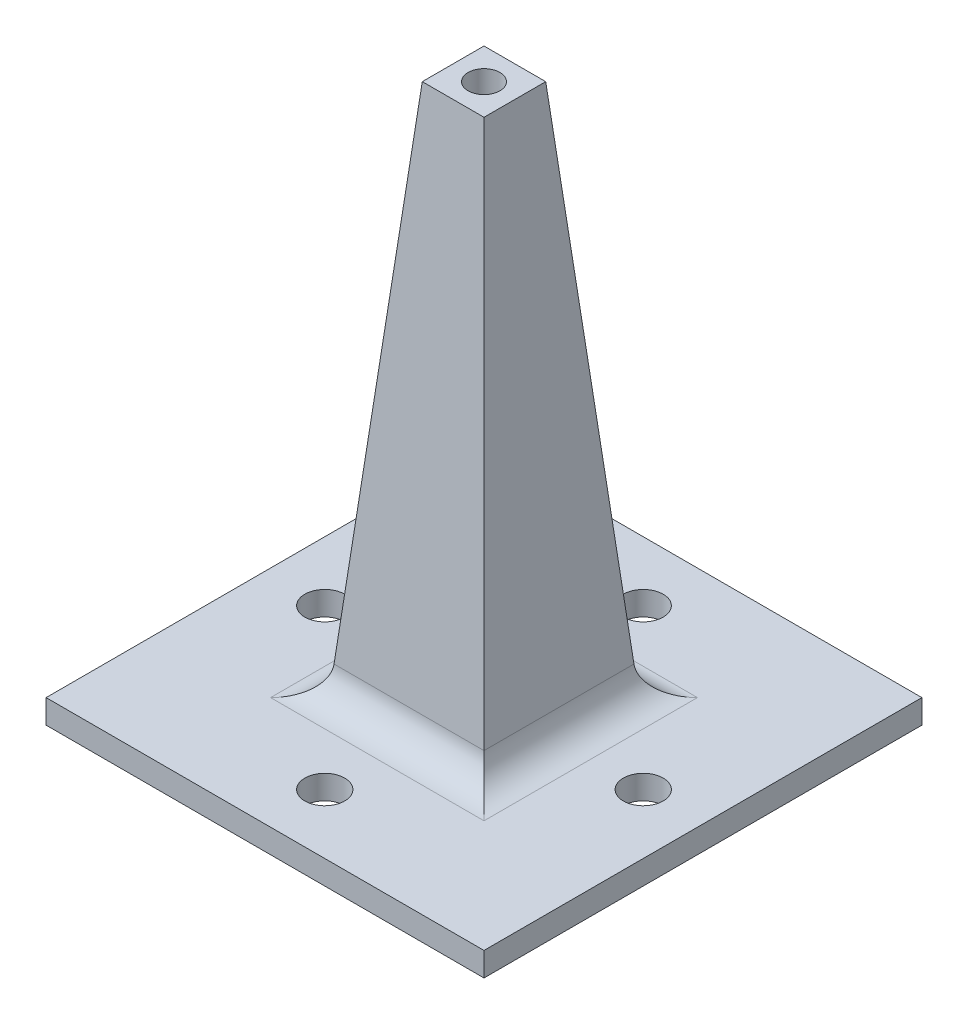
ISO-10303-21;
HEADER;
FILE_DESCRIPTION(('STEP AP214'),'2;1');
FILE_NAME('part.step','',(''),(''),'','','');
FILE_SCHEMA(('AUTOMOTIVE_DESIGN { 1 0 10303 214 1 1 1 1 }'));
ENDSEC;
DATA;
#1=APPLICATION_CONTEXT('core data for automotive mechanical design processes');
#2=APPLICATION_PROTOCOL_DEFINITION('international standard','automotive_design',2000,#1);
#3=PRODUCT_CONTEXT('',#1,'mechanical');
#4=PRODUCT('Part','Part','',(#3));
#5=PRODUCT_RELATED_PRODUCT_CATEGORY('part','',(#4));
#6=PRODUCT_DEFINITION_FORMATION('','',#4);
#7=PRODUCT_DEFINITION_CONTEXT('part definition',#1,'design');
#8=PRODUCT_DEFINITION('design','',#6,#7);
#9=PRODUCT_DEFINITION_SHAPE('','',#8);
#10=(LENGTH_UNIT() NAMED_UNIT(*) SI_UNIT(.MILLI.,.METRE.));
#11=(NAMED_UNIT(*) PLANE_ANGLE_UNIT() SI_UNIT($,.RADIAN.));
#12=(NAMED_UNIT(*) SI_UNIT($,.STERADIAN.) SOLID_ANGLE_UNIT());
#13=UNCERTAINTY_MEASURE_WITH_UNIT(LENGTH_MEASURE(1.E-05),#10,'distance_accuracy_value','');
#14=(GEOMETRIC_REPRESENTATION_CONTEXT(3) GLOBAL_UNCERTAINTY_ASSIGNED_CONTEXT((#13)) GLOBAL_UNIT_ASSIGNED_CONTEXT((#10,
#11,#12)) REPRESENTATION_CONTEXT('',''));
#15=CARTESIAN_POINT('',(0.,0.,0.));
#16=DIRECTION('',(0.,0.,1.));
#17=DIRECTION('',(1.,0.,0.));
#18=AXIS2_PLACEMENT_3D('',#15,#16,#17);
#19=CARTESIAN_POINT('',(9.99999999999999,0.,-10.));
#20=DIRECTION('',(0.996194698091746,0.0871557427476582,0.));
#21=DIRECTION('',(-0.0871557427476582,0.996194698091746,0.));
#22=AXIS2_PLACEMENT_3D('',#19,#20,#21);
#23=PLANE('',#22);
#24=DIRECTION('',(0.0868265938642477,-0.992432509138967,0.0868265938642476));
#25=VECTOR('',#24,1.);
#26=CARTESIAN_POINT('',(9.84922285195865,1.72339068817371,9.84922285195866));
#27=LINE('',#26,#25);
#28=CARTESIAN_POINT('',(3.87579355318531,70.,3.87579355318532));
#29=VERTEX_POINT('',#28);
#30=CARTESIAN_POINT('',(9.41807991312493,6.65137702900937,9.41807991312494));
#31=VERTEX_POINT('',#30);
#32=EDGE_CURVE('E171',#29,#31,#27,.T.);
#33=ORIENTED_EDGE('',*,*,#32,.T.);
#34=DIRECTION('',(0.,0.,1.));
#35=VECTOR('',#34,1.);
#36=CARTESIAN_POINT('',(9.41807991312493,6.65137702900937,-9.73753400942223));
#37=LINE('',#36,#35);
#38=CARTESIAN_POINT('',(9.41807991312493,6.65137702900937,-9.41807991312494));
#39=VERTEX_POINT('',#38);
#40=EDGE_CURVE('E43',#31,#39,#37,.F.);
#41=ORIENTED_EDGE('',*,*,#40,.T.);
#42=DIRECTION('',(0.0868265938642476,-0.992432509138967,-0.0868265938642476));
#43=VECTOR('',#42,1.);
#44=CARTESIAN_POINT('',(9.84922285195865,1.72339068817371,-9.84922285195866));
#45=LINE('',#44,#43);
#46=CARTESIAN_POINT('',(3.87579355318531,70.,-3.87579355318532));
#47=VERTEX_POINT('',#46);
#48=EDGE_CURVE('E167',#47,#39,#45,.T.);
#49=ORIENTED_EDGE('',*,*,#48,.F.);
#50=DIRECTION('',(0.,0.,1.));
#51=VECTOR('',#50,1.);
#52=CARTESIAN_POINT('',(3.87579355318531,70.,-10.));
#53=LINE('',#52,#51);
#54=EDGE_CURVE('E164',#29,#47,#53,.F.);
#55=ORIENTED_EDGE('',*,*,#54,.F.);
#56=EDGE_LOOP('',(#33,#41,#49,#55));
#57=FACE_BOUND('',#56,.T.);
#58=ADVANCED_FACE('F34',(#57),#23,.T.);
#59=CARTESIAN_POINT('',(-10.,0.,-10.));
#60=DIRECTION('',(0.,0.0871557427476582,-0.996194698091746));
#61=DIRECTION('',(0.,0.996194698091746,0.0871557427476582));
#62=AXIS2_PLACEMENT_3D('',#59,#60,#61);
#63=PLANE('',#62);
#64=ORIENTED_EDGE('',*,*,#48,.T.);
#65=DIRECTION('',(1.,0.,0.));
#66=VECTOR('',#65,1.);
#67=CARTESIAN_POINT('',(-9.73753400942223,6.65137702900937,-9.41807991312494));
#68=LINE('',#67,#66);
#69=CARTESIAN_POINT('',(-9.41807991312495,6.65137702900937,-9.41807991312494));
#70=VERTEX_POINT('',#69);
#71=EDGE_CURVE('E11',#39,#70,#68,.F.);
#72=ORIENTED_EDGE('',*,*,#71,.T.);
#73=DIRECTION('',(-0.0868265938642477,-0.992432509138967,-0.0868265938642476));
#74=VECTOR('',#73,1.);
#75=CARTESIAN_POINT('',(-10.,0.,-10.));
#76=LINE('',#75,#74);
#77=CARTESIAN_POINT('',(-3.87579355318532,70.,-3.87579355318532));
#78=VERTEX_POINT('',#77);
#79=EDGE_CURVE('E170',#78,#70,#76,.T.);
#80=ORIENTED_EDGE('',*,*,#79,.F.);
#81=DIRECTION('',(1.,0.,0.));
#82=VECTOR('',#81,1.);
#83=CARTESIAN_POINT('',(-10.,70.,-3.87579355318532));
#84=LINE('',#83,#82);
#85=EDGE_CURVE('E180',#47,#78,#84,.F.);
#86=ORIENTED_EDGE('',*,*,#85,.F.);
#87=EDGE_LOOP('',(#64,#72,#80,#86));
#88=FACE_BOUND('',#87,.T.);
#89=ADVANCED_FACE('F235',(#88),#63,.T.);
#90=CARTESIAN_POINT('',(-10.,0.,-10.));
#91=DIRECTION('',(-0.996194698091746,0.0871557427476582,0.));
#92=DIRECTION('',(-0.0871557427476582,-0.996194698091746,0.));
#93=AXIS2_PLACEMENT_3D('',#90,#91,#92);
#94=PLANE('',#93);
#95=ORIENTED_EDGE('',*,*,#79,.T.);
#96=DIRECTION('',(0.,0.,-1.));
#97=VECTOR('',#96,1.);
#98=CARTESIAN_POINT('',(-9.41807991312494,6.65137702900937,9.73753400942223));
#99=LINE('',#98,#97);
#100=CARTESIAN_POINT('',(-9.41807991312494,6.65137702900937,9.41807991312494));
#101=VERTEX_POINT('',#100);
#102=EDGE_CURVE('E193',#70,#101,#99,.F.);
#103=ORIENTED_EDGE('',*,*,#102,.T.);
#104=DIRECTION('',(-0.0868265938642476,-0.992432509138967,0.0868265938642476));
#105=VECTOR('',#104,1.);
#106=CARTESIAN_POINT('',(-10.,0.,10.));
#107=LINE('',#106,#105);
#108=CARTESIAN_POINT('',(-3.87579355318532,70.,3.87579355318532));
#109=VERTEX_POINT('',#108);
#110=EDGE_CURVE('E173',#109,#101,#107,.T.);
#111=ORIENTED_EDGE('',*,*,#110,.F.);
#112=DIRECTION('',(0.,0.,-1.));
#113=VECTOR('',#112,1.);
#114=CARTESIAN_POINT('',(-3.87579355318532,70.,-10.));
#115=LINE('',#114,#113);
#116=EDGE_CURVE('E182',#78,#109,#115,.F.);
#117=ORIENTED_EDGE('',*,*,#116,.F.);
#118=EDGE_LOOP('',(#95,#103,#111,#117));
#119=FACE_BOUND('',#118,.T.);
#120=ADVANCED_FACE('F240',(#119),#94,.T.);
#121=CARTESIAN_POINT('',(-10.,0.,10.));
#122=DIRECTION('',(0.,0.0871557427476582,0.996194698091746));
#123=DIRECTION('',(0.,-0.996194698091746,0.0871557427476582));
#124=AXIS2_PLACEMENT_3D('',#121,#122,#123);
#125=PLANE('',#124);
#126=ORIENTED_EDGE('',*,*,#110,.T.);
#127=DIRECTION('',(-1.,0.,0.));
#128=VECTOR('',#127,1.);
#129=CARTESIAN_POINT('',(9.73753400942222,6.65137702900937,9.41807991312494));
#130=LINE('',#129,#128);
#131=EDGE_CURVE('E58',#101,#31,#130,.F.);
#132=ORIENTED_EDGE('',*,*,#131,.T.);
#133=ORIENTED_EDGE('',*,*,#32,.F.);
#134=DIRECTION('',(-1.,0.,0.));
#135=VECTOR('',#134,1.);
#136=CARTESIAN_POINT('',(-10.,70.,3.87579355318532));
#137=LINE('',#136,#135);
#138=EDGE_CURVE('E174',#109,#29,#137,.F.);
#139=ORIENTED_EDGE('',*,*,#138,.F.);
#140=EDGE_LOOP('',(#126,#132,#133,#139));
#141=FACE_BOUND('',#140,.T.);
#142=ADVANCED_FACE('F246',(#141),#125,.T.);
#143=CARTESIAN_POINT('',(0.,70.,0.));
#144=DIRECTION('',(0.,1.,0.));
#145=DIRECTION('',(0.,0.,1.));
#146=AXIS2_PLACEMENT_3D('',#143,#144,#145);
#147=PLANE('',#146);
#148=CARTESIAN_POINT('',(0.,70.,0.));
#149=DIRECTION('',(0.,1.,0.));
#150=DIRECTION('',(0.,0.,1.));
#151=AXIS2_PLACEMENT_3D('',#148,#149,#150);
#152=CIRCLE('',#151,2.);
#153=CARTESIAN_POINT('',(0.,70.,2.));
#154=VERTEX_POINT('',#153);
#155=EDGE_CURVE('E157',#154,#154,#152,.T.);
#156=ORIENTED_EDGE('',*,*,#155,.F.);
#157=EDGE_LOOP('',(#156));
#158=FACE_BOUND('',#157,.T.);
#159=ORIENTED_EDGE('',*,*,#54,.T.);
#160=ORIENTED_EDGE('',*,*,#85,.T.);
#161=ORIENTED_EDGE('',*,*,#116,.T.);
#162=ORIENTED_EDGE('',*,*,#138,.T.);
#163=EDGE_LOOP('',(#159,#160,#161,#162));
#164=FACE_BOUND('',#163,.T.);
#165=ADVANCED_FACE('F249',(#158,#164),#147,.T.);
#166=CARTESIAN_POINT('',(0.,57.5,0.));
#167=DIRECTION('',(0.,1.,0.));
#168=DIRECTION('',(0.,0.,1.));
#169=AXIS2_PLACEMENT_3D('',#166,#167,#168);
#170=CYLINDRICAL_SURFACE('',#169,2.);
#171=CARTESIAN_POINT('',(0.,57.5,0.));
#172=DIRECTION('',(0.,1.,0.));
#173=DIRECTION('',(0.,0.,1.));
#174=AXIS2_PLACEMENT_3D('',#171,#172,#173);
#175=CIRCLE('',#174,2.);
#176=CARTESIAN_POINT('',(0.,57.5,2.));
#177=VERTEX_POINT('',#176);
#178=EDGE_CURVE('E161',#177,#177,#175,.T.);
#179=ORIENTED_EDGE('',*,*,#178,.F.);
#180=EDGE_LOOP('',(#179));
#181=FACE_BOUND('',#180,.T.);
#182=ORIENTED_EDGE('',*,*,#155,.T.);
#183=EDGE_LOOP('',(#182));
#184=FACE_BOUND('',#183,.T.);
#185=ADVANCED_FACE('F292',(#181,#184),#170,.F.);
#186=CARTESIAN_POINT('',(0.,57.5,0.));
#187=DIRECTION('',(0.,1.,0.));
#188=DIRECTION('',(0.,0.,1.));
#189=AXIS2_PLACEMENT_3D('',#186,#187,#188);
#190=PLANE('',#189);
#191=ORIENTED_EDGE('',*,*,#178,.T.);
#192=EDGE_LOOP('',(#191));
#193=FACE_BOUND('',#192,.T.);
#194=ADVANCED_FACE('F283',(#193),#190,.T.);
#195=CARTESIAN_POINT('',(0.,3.,0.));
#196=DIRECTION('',(0.,-1.,0.));
#197=DIRECTION('',(0.,0.,-1.));
#198=AXIS2_PLACEMENT_3D('',#195,#196,#197);
#199=PLANE('',#198);
#200=CARTESIAN_POINT('',(-20.,3.,0.));
#201=DIRECTION('',(0.,1.,0.));
#202=DIRECTION('',(0.,0.,1.));
#203=AXIS2_PLACEMENT_3D('',#200,#201,#202);
#204=CIRCLE('',#203,2.5);
#205=CARTESIAN_POINT('',(-20.,3.,2.5));
#206=VERTEX_POINT('',#205);
#207=EDGE_CURVE('E211',#206,#206,#204,.T.);
#208=ORIENTED_EDGE('',*,*,#207,.F.);
#209=EDGE_LOOP('',(#208));
#210=FACE_BOUND('',#209,.T.);
#211=CARTESIAN_POINT('',(0.,3.,-20.));
#212=DIRECTION('',(0.,1.,0.));
#213=DIRECTION('',(0.,0.,1.));
#214=AXIS2_PLACEMENT_3D('',#211,#212,#213);
#215=CIRCLE('',#214,2.5);
#216=CARTESIAN_POINT('',(0.,3.,-17.5));
#217=VERTEX_POINT('',#216);
#218=EDGE_CURVE('E451',#217,#217,#215,.T.);
#219=ORIENTED_EDGE('',*,*,#218,.F.);
#220=EDGE_LOOP('',(#219));
#221=FACE_BOUND('',#220,.T.);
#222=CARTESIAN_POINT('',(20.,3.,0.));
#223=DIRECTION('',(0.,1.,0.));
#224=DIRECTION('',(0.,0.,1.));
#225=AXIS2_PLACEMENT_3D('',#222,#223,#224);
#226=CIRCLE('',#225,2.5);
#227=CARTESIAN_POINT('',(20.,3.,2.5));
#228=VERTEX_POINT('',#227);
#229=EDGE_CURVE('E441',#228,#228,#226,.T.);
#230=ORIENTED_EDGE('',*,*,#229,.F.);
#231=EDGE_LOOP('',(#230));
#232=FACE_BOUND('',#231,.T.);
#233=CARTESIAN_POINT('',(0.,3.,20.));
#234=DIRECTION('',(0.,1.,0.));
#235=DIRECTION('',(0.,0.,1.));
#236=AXIS2_PLACEMENT_3D('',#233,#234,#235);
#237=CIRCLE('',#236,2.5);
#238=CARTESIAN_POINT('',(0.,3.,22.5));
#239=VERTEX_POINT('',#238);
#240=EDGE_CURVE('E145',#239,#239,#237,.T.);
#241=ORIENTED_EDGE('',*,*,#240,.F.);
#242=EDGE_LOOP('',(#241));
#243=FACE_BOUND('',#242,.T.);
#244=DIRECTION('',(1.,0.,0.));
#245=VECTOR('',#244,1.);
#246=CARTESIAN_POINT('',(-9.73753400942223,3.,13.4028587054919));
#247=LINE('',#246,#245);
#248=CARTESIAN_POINT('',(13.4028587054919,3.,13.4028587054919));
#249=VERTEX_POINT('',#248);
#250=CARTESIAN_POINT('',(-13.4028587054919,3.,13.4028587054919));
#251=VERTEX_POINT('',#250);
#252=EDGE_CURVE('E188',#249,#251,#247,.F.);
#253=ORIENTED_EDGE('',*,*,#252,.T.);
#254=DIRECTION('',(0.,0.,1.));
#255=VECTOR('',#254,1.);
#256=CARTESIAN_POINT('',(-13.4028587054919,3.,-9.73753400942223));
#257=LINE('',#256,#255);
#258=CARTESIAN_POINT('',(-13.4028587054919,3.,-13.4028587054919));
#259=VERTEX_POINT('',#258);
#260=EDGE_CURVE('E190',#251,#259,#257,.F.);
#261=ORIENTED_EDGE('',*,*,#260,.T.);
#262=DIRECTION('',(-1.,0.,0.));
#263=VECTOR('',#262,1.);
#264=CARTESIAN_POINT('',(9.73753400942222,3.,-13.4028587054919));
#265=LINE('',#264,#263);
#266=CARTESIAN_POINT('',(13.4028587054919,3.,-13.4028587054919));
#267=VERTEX_POINT('',#266);
#268=EDGE_CURVE('E169',#259,#267,#265,.F.);
#269=ORIENTED_EDGE('',*,*,#268,.T.);
#270=DIRECTION('',(0.,0.,-1.));
#271=VECTOR('',#270,1.);
#272=CARTESIAN_POINT('',(13.4028587054919,3.,9.73753400942223));
#273=LINE('',#272,#271);
#274=EDGE_CURVE('E186',#267,#249,#273,.F.);
#275=ORIENTED_EDGE('',*,*,#274,.T.);
#276=EDGE_LOOP('',(#253,#261,#269,#275));
#277=FACE_BOUND('',#276,.T.);
#278=DIRECTION('',(0.,0.,1.));
#279=VECTOR('',#278,1.);
#280=CARTESIAN_POINT('',(27.5,3.,27.5));
#281=LINE('',#280,#279);
#282=CARTESIAN_POINT('',(27.5,3.,-27.5));
#283=VERTEX_POINT('',#282);
#284=CARTESIAN_POINT('',(27.5,3.,27.5));
#285=VERTEX_POINT('',#284);
#286=EDGE_CURVE('E132',#283,#285,#281,.T.);
#287=ORIENTED_EDGE('',*,*,#286,.F.);
#288=DIRECTION('',(1.,0.,0.));
#289=VECTOR('',#288,1.);
#290=CARTESIAN_POINT('',(-27.5,3.,-27.5));
#291=LINE('',#290,#289);
#292=CARTESIAN_POINT('',(-27.5,3.,-27.5));
#293=VERTEX_POINT('',#292);
#294=EDGE_CURVE('E125',#293,#283,#291,.T.);
#295=ORIENTED_EDGE('',*,*,#294,.F.);
#296=DIRECTION('',(0.,0.,-1.));
#297=VECTOR('',#296,1.);
#298=CARTESIAN_POINT('',(-27.5,3.,27.5));
#299=LINE('',#298,#297);
#300=CARTESIAN_POINT('',(-27.5,3.,27.5));
#301=VERTEX_POINT('',#300);
#302=EDGE_CURVE('E135',#301,#293,#299,.T.);
#303=ORIENTED_EDGE('',*,*,#302,.F.);
#304=DIRECTION('',(-1.,0.,0.));
#305=VECTOR('',#304,1.);
#306=CARTESIAN_POINT('',(-27.5,3.,27.5));
#307=LINE('',#306,#305);
#308=EDGE_CURVE('E117',#285,#301,#307,.T.);
#309=ORIENTED_EDGE('',*,*,#308,.F.);
#310=EDGE_LOOP('',(#287,#295,#303,#309));
#311=FACE_BOUND('',#310,.T.);
#312=ADVANCED_FACE('F130',(#210,#221,#232,#243,#277,#311),#199,.F.);
#313=CARTESIAN_POINT('',(27.5,3.,27.5));
#314=DIRECTION('',(1.,0.,0.));
#315=DIRECTION('',(0.,0.,-1.));
#316=AXIS2_PLACEMENT_3D('',#313,#314,#315);
#317=PLANE('',#316);
#318=DIRECTION('',(0.,0.,1.));
#319=VECTOR('',#318,1.);
#320=CARTESIAN_POINT('',(27.5,0.,27.5));
#321=LINE('',#320,#319);
#322=CARTESIAN_POINT('',(27.5,0.,-27.5));
#323=VERTEX_POINT('',#322);
#324=CARTESIAN_POINT('',(27.5,0.,27.5));
#325=VERTEX_POINT('',#324);
#326=EDGE_CURVE('E150',#323,#325,#321,.T.);
#327=ORIENTED_EDGE('',*,*,#326,.F.);
#328=DIRECTION('',(0.,-1.,0.));
#329=VECTOR('',#328,1.);
#330=CARTESIAN_POINT('',(27.5,3.,-27.5));
#331=LINE('',#330,#329);
#332=EDGE_CURVE('E138',#283,#323,#331,.T.);
#333=ORIENTED_EDGE('',*,*,#332,.F.);
#334=ORIENTED_EDGE('',*,*,#286,.T.);
#335=DIRECTION('',(0.,-1.,0.));
#336=VECTOR('',#335,1.);
#337=CARTESIAN_POINT('',(27.5,3.,27.5));
#338=LINE('',#337,#336);
#339=EDGE_CURVE('E114',#285,#325,#338,.T.);
#340=ORIENTED_EDGE('',*,*,#339,.T.);
#341=EDGE_LOOP('',(#327,#333,#334,#340));
#342=FACE_BOUND('',#341,.T.);
#343=ADVANCED_FACE('F137',(#342),#317,.T.);
#344=CARTESIAN_POINT('',(-27.5,3.,-27.5));
#345=DIRECTION('',(0.,0.,-1.));
#346=DIRECTION('',(-1.,0.,0.));
#347=AXIS2_PLACEMENT_3D('',#344,#345,#346);
#348=PLANE('',#347);
#349=DIRECTION('',(1.,0.,0.));
#350=VECTOR('',#349,1.);
#351=CARTESIAN_POINT('',(-27.5,0.,-27.5));
#352=LINE('',#351,#350);
#353=CARTESIAN_POINT('',(-27.5,0.,-27.5));
#354=VERTEX_POINT('',#353);
#355=EDGE_CURVE('E139',#354,#323,#352,.T.);
#356=ORIENTED_EDGE('',*,*,#355,.F.);
#357=DIRECTION('',(0.,-1.,0.));
#358=VECTOR('',#357,1.);
#359=CARTESIAN_POINT('',(-27.5,3.,-27.5));
#360=LINE('',#359,#358);
#361=EDGE_CURVE('E158',#293,#354,#360,.T.);
#362=ORIENTED_EDGE('',*,*,#361,.F.);
#363=ORIENTED_EDGE('',*,*,#294,.T.);
#364=ORIENTED_EDGE('',*,*,#332,.T.);
#365=EDGE_LOOP('',(#356,#362,#363,#364));
#366=FACE_BOUND('',#365,.T.);
#367=ADVANCED_FACE('F290',(#366),#348,.T.);
#368=CARTESIAN_POINT('',(-27.5,3.,27.5));
#369=DIRECTION('',(-1.,0.,0.));
#370=DIRECTION('',(0.,0.,1.));
#371=AXIS2_PLACEMENT_3D('',#368,#369,#370);
#372=PLANE('',#371);
#373=DIRECTION('',(0.,0.,-1.));
#374=VECTOR('',#373,1.);
#375=CARTESIAN_POINT('',(-27.5,0.,27.5));
#376=LINE('',#375,#374);
#377=CARTESIAN_POINT('',(-27.5,0.,27.5));
#378=VERTEX_POINT('',#377);
#379=EDGE_CURVE('E142',#378,#354,#376,.T.);
#380=ORIENTED_EDGE('',*,*,#379,.F.);
#381=DIRECTION('',(0.,-1.,0.));
#382=VECTOR('',#381,1.);
#383=CARTESIAN_POINT('',(-27.5,3.,27.5));
#384=LINE('',#383,#382);
#385=EDGE_CURVE('E124',#301,#378,#384,.T.);
#386=ORIENTED_EDGE('',*,*,#385,.F.);
#387=ORIENTED_EDGE('',*,*,#302,.T.);
#388=ORIENTED_EDGE('',*,*,#361,.T.);
#389=EDGE_LOOP('',(#380,#386,#387,#388));
#390=FACE_BOUND('',#389,.T.);
#391=ADVANCED_FACE('F302',(#390),#372,.T.);
#392=CARTESIAN_POINT('',(-27.5,3.,27.5));
#393=DIRECTION('',(0.,0.,1.));
#394=DIRECTION('',(1.,0.,0.));
#395=AXIS2_PLACEMENT_3D('',#392,#393,#394);
#396=PLANE('',#395);
#397=DIRECTION('',(-1.,0.,0.));
#398=VECTOR('',#397,1.);
#399=CARTESIAN_POINT('',(-27.5,0.,27.5));
#400=LINE('',#399,#398);
#401=EDGE_CURVE('E119',#325,#378,#400,.T.);
#402=ORIENTED_EDGE('',*,*,#401,.F.);
#403=ORIENTED_EDGE('',*,*,#339,.F.);
#404=ORIENTED_EDGE('',*,*,#308,.T.);
#405=ORIENTED_EDGE('',*,*,#385,.T.);
#406=EDGE_LOOP('',(#402,#403,#404,#405));
#407=FACE_BOUND('',#406,.T.);
#408=ADVANCED_FACE('F116',(#407),#396,.T.);
#409=CARTESIAN_POINT('',(0.,0.,0.));
#410=DIRECTION('',(0.,1.,0.));
#411=DIRECTION('',(0.,0.,1.));
#412=AXIS2_PLACEMENT_3D('',#409,#410,#411);
#413=PLANE('',#412);
#414=CARTESIAN_POINT('',(-20.,0.,0.));
#415=DIRECTION('',(0.,1.,0.));
#416=DIRECTION('',(0.,0.,1.));
#417=AXIS2_PLACEMENT_3D('',#414,#415,#416);
#418=CIRCLE('',#417,2.5);
#419=CARTESIAN_POINT('',(-20.,0.,2.5));
#420=VERTEX_POINT('',#419);
#421=EDGE_CURVE('E38',#420,#420,#418,.T.);
#422=ORIENTED_EDGE('',*,*,#421,.T.);
#423=EDGE_LOOP('',(#422));
#424=FACE_BOUND('',#423,.T.);
#425=CARTESIAN_POINT('',(0.,0.,-20.));
#426=DIRECTION('',(0.,1.,0.));
#427=DIRECTION('',(0.,0.,1.));
#428=AXIS2_PLACEMENT_3D('',#425,#426,#427);
#429=CIRCLE('',#428,2.5);
#430=CARTESIAN_POINT('',(0.,0.,-17.5));
#431=VERTEX_POINT('',#430);
#432=EDGE_CURVE('E213',#431,#431,#429,.T.);
#433=ORIENTED_EDGE('',*,*,#432,.T.);
#434=EDGE_LOOP('',(#433));
#435=FACE_BOUND('',#434,.T.);
#436=CARTESIAN_POINT('',(20.,0.,0.));
#437=DIRECTION('',(0.,1.,0.));
#438=DIRECTION('',(0.,0.,1.));
#439=AXIS2_PLACEMENT_3D('',#436,#437,#438);
#440=CIRCLE('',#439,2.5);
#441=CARTESIAN_POINT('',(20.,0.,2.5));
#442=VERTEX_POINT('',#441);
#443=EDGE_CURVE('E210',#442,#442,#440,.T.);
#444=ORIENTED_EDGE('',*,*,#443,.T.);
#445=EDGE_LOOP('',(#444));
#446=FACE_BOUND('',#445,.T.);
#447=CARTESIAN_POINT('',(0.,0.,20.));
#448=DIRECTION('',(0.,1.,0.));
#449=DIRECTION('',(0.,0.,1.));
#450=AXIS2_PLACEMENT_3D('',#447,#448,#449);
#451=CIRCLE('',#450,2.5);
#452=CARTESIAN_POINT('',(0.,0.,22.5));
#453=VERTEX_POINT('',#452);
#454=EDGE_CURVE('E207',#453,#453,#451,.T.);
#455=ORIENTED_EDGE('',*,*,#454,.T.);
#456=EDGE_LOOP('',(#455));
#457=FACE_BOUND('',#456,.T.);
#458=ORIENTED_EDGE('',*,*,#326,.T.);
#459=ORIENTED_EDGE('',*,*,#401,.T.);
#460=ORIENTED_EDGE('',*,*,#379,.T.);
#461=ORIENTED_EDGE('',*,*,#355,.T.);
#462=EDGE_LOOP('',(#458,#459,#460,#461));
#463=FACE_BOUND('',#462,.T.);
#464=ADVANCED_FACE('F220',(#424,#435,#446,#457,#463),#413,.F.);
#465=CARTESIAN_POINT('',(13.4028587054919,7.,0.));
#466=DIRECTION('',(0.,0.,1.));
#467=DIRECTION('',(1.,0.,0.));
#468=AXIS2_PLACEMENT_3D('',#465,#466,#467);
#469=CYLINDRICAL_SURFACE('',#468,4.);
#470=CARTESIAN_POINT('',(13.4028587054919,7.,-13.4028587054919));
#471=DIRECTION('',(0.707106781186547,0.,0.707106781186547));
#472=DIRECTION('',(0.707106781186547,0.,-0.707106781186548));
#473=AXIS2_PLACEMENT_3D('',#470,#471,#472);
#474=ELLIPSE('',#473,5.65685424949238,4.);
#475=EDGE_CURVE('E202',#39,#267,#474,.T.);
#476=ORIENTED_EDGE('',*,*,#475,.F.);
#477=ORIENTED_EDGE('',*,*,#40,.F.);
#478=CARTESIAN_POINT('',(13.4028587054919,7.,13.4028587054919));
#479=DIRECTION('',(-0.707106781186547,0.,0.707106781186548));
#480=DIRECTION('',(0.707106781186547,0.,0.707106781186547));
#481=AXIS2_PLACEMENT_3D('',#478,#479,#480);
#482=ELLIPSE('',#481,5.65685424949238,4.);
#483=EDGE_CURVE('E152',#249,#31,#482,.F.);
#484=ORIENTED_EDGE('',*,*,#483,.F.);
#485=ORIENTED_EDGE('',*,*,#274,.F.);
#486=EDGE_LOOP('',(#476,#477,#484,#485));
#487=FACE_BOUND('',#486,.T.);
#488=ADVANCED_FACE('F36',(#487),#469,.F.);
#489=CARTESIAN_POINT('',(0.,7.,13.4028587054919));
#490=DIRECTION('',(-1.,0.,0.));
#491=DIRECTION('',(0.,0.,1.));
#492=AXIS2_PLACEMENT_3D('',#489,#490,#491);
#493=CYLINDRICAL_SURFACE('',#492,4.);
#494=ORIENTED_EDGE('',*,*,#483,.T.);
#495=ORIENTED_EDGE('',*,*,#131,.F.);
#496=CARTESIAN_POINT('',(-13.4028587054919,7.,13.4028587054919));
#497=DIRECTION('',(-0.707106781186548,0.,-0.707106781186547));
#498=DIRECTION('',(-0.707106781186547,0.,0.707106781186548));
#499=AXIS2_PLACEMENT_3D('',#496,#497,#498);
#500=ELLIPSE('',#499,5.65685424949238,4.);
#501=EDGE_CURVE('E200',#251,#101,#500,.F.);
#502=ORIENTED_EDGE('',*,*,#501,.F.);
#503=ORIENTED_EDGE('',*,*,#252,.F.);
#504=EDGE_LOOP('',(#494,#495,#502,#503));
#505=FACE_BOUND('',#504,.T.);
#506=ADVANCED_FACE('F260',(#505),#493,.F.);
#507=CARTESIAN_POINT('',(0.,7.,-13.4028587054919));
#508=DIRECTION('',(1.,0.,0.));
#509=DIRECTION('',(0.,0.,-1.));
#510=AXIS2_PLACEMENT_3D('',#507,#508,#509);
#511=CYLINDRICAL_SURFACE('',#510,4.);
#512=ORIENTED_EDGE('',*,*,#475,.T.);
#513=ORIENTED_EDGE('',*,*,#268,.F.);
#514=CARTESIAN_POINT('',(-13.4028587054919,7.,-13.4028587054919));
#515=DIRECTION('',(0.707106781186547,0.,-0.707106781186548));
#516=DIRECTION('',(0.707106781186548,0.,0.707106781186547));
#517=AXIS2_PLACEMENT_3D('',#514,#515,#516);
#518=ELLIPSE('',#517,5.65685424949238,4.);
#519=EDGE_CURVE('E198',#70,#259,#518,.T.);
#520=ORIENTED_EDGE('',*,*,#519,.F.);
#521=ORIENTED_EDGE('',*,*,#71,.F.);
#522=EDGE_LOOP('',(#512,#513,#520,#521));
#523=FACE_BOUND('',#522,.T.);
#524=ADVANCED_FACE('F257',(#523),#511,.F.);
#525=CARTESIAN_POINT('',(-13.4028587054919,7.,0.));
#526=DIRECTION('',(0.,0.,-1.));
#527=DIRECTION('',(-1.,0.,0.));
#528=AXIS2_PLACEMENT_3D('',#525,#526,#527);
#529=CYLINDRICAL_SURFACE('',#528,4.);
#530=ORIENTED_EDGE('',*,*,#501,.T.);
#531=ORIENTED_EDGE('',*,*,#102,.F.);
#532=ORIENTED_EDGE('',*,*,#519,.T.);
#533=ORIENTED_EDGE('',*,*,#260,.F.);
#534=EDGE_LOOP('',(#530,#531,#532,#533));
#535=FACE_BOUND('',#534,.T.);
#536=ADVANCED_FACE('F253',(#535),#529,.F.);
#537=CARTESIAN_POINT('',(0.,-7.,20.));
#538=DIRECTION('',(0.,1.,0.));
#539=DIRECTION('',(0.,0.,1.));
#540=AXIS2_PLACEMENT_3D('',#537,#538,#539);
#541=CYLINDRICAL_SURFACE('',#540,2.5);
#542=ORIENTED_EDGE('',*,*,#240,.T.);
#543=EDGE_LOOP('',(#542));
#544=FACE_BOUND('',#543,.T.);
#545=ORIENTED_EDGE('',*,*,#454,.F.);
#546=EDGE_LOOP('',(#545));
#547=FACE_BOUND('',#546,.T.);
#548=ADVANCED_FACE('F256',(#544,#547),#541,.F.);
#549=CARTESIAN_POINT('',(20.,-7.,0.));
#550=DIRECTION('',(0.,1.,0.));
#551=DIRECTION('',(0.,0.,1.));
#552=AXIS2_PLACEMENT_3D('',#549,#550,#551);
#553=CYLINDRICAL_SURFACE('',#552,2.5);
#554=ORIENTED_EDGE('',*,*,#229,.T.);
#555=EDGE_LOOP('',(#554));
#556=FACE_BOUND('',#555,.T.);
#557=ORIENTED_EDGE('',*,*,#443,.F.);
#558=EDGE_LOOP('',(#557));
#559=FACE_BOUND('',#558,.T.);
#560=ADVANCED_FACE('F230',(#556,#559),#553,.F.);
#561=CARTESIAN_POINT('',(0.,-7.,-20.));
#562=DIRECTION('',(0.,1.,0.));
#563=DIRECTION('',(0.,0.,1.));
#564=AXIS2_PLACEMENT_3D('',#561,#562,#563);
#565=CYLINDRICAL_SURFACE('',#564,2.5);
#566=ORIENTED_EDGE('',*,*,#218,.T.);
#567=EDGE_LOOP('',(#566));
#568=FACE_BOUND('',#567,.T.);
#569=ORIENTED_EDGE('',*,*,#432,.F.);
#570=EDGE_LOOP('',(#569));
#571=FACE_BOUND('',#570,.T.);
#572=ADVANCED_FACE('F224',(#568,#571),#565,.F.);
#573=CARTESIAN_POINT('',(-20.,-7.,0.));
#574=DIRECTION('',(0.,1.,0.));
#575=DIRECTION('',(0.,0.,1.));
#576=AXIS2_PLACEMENT_3D('',#573,#574,#575);
#577=CYLINDRICAL_SURFACE('',#576,2.5);
#578=ORIENTED_EDGE('',*,*,#207,.T.);
#579=EDGE_LOOP('',(#578));
#580=FACE_BOUND('',#579,.T.);
#581=ORIENTED_EDGE('',*,*,#421,.F.);
#582=EDGE_LOOP('',(#581));
#583=FACE_BOUND('',#582,.T.);
#584=ADVANCED_FACE('F222',(#580,#583),#577,.F.);
#585=CLOSED_SHELL('',(#58,#89,#120,#142,#165,#185,#194,#312,#343,#367,#391,#408,#464,#488,#506,
#524,#536,#548,#560,#572,#584));
#586=MANIFOLD_SOLID_BREP('B2',#585);
#587=ADVANCED_BREP_SHAPE_REPRESENTATION('',(#18,#586),#14);
#588=SHAPE_DEFINITION_REPRESENTATION(#9,#587);
ENDSEC;
END-ISO-10303-21;
